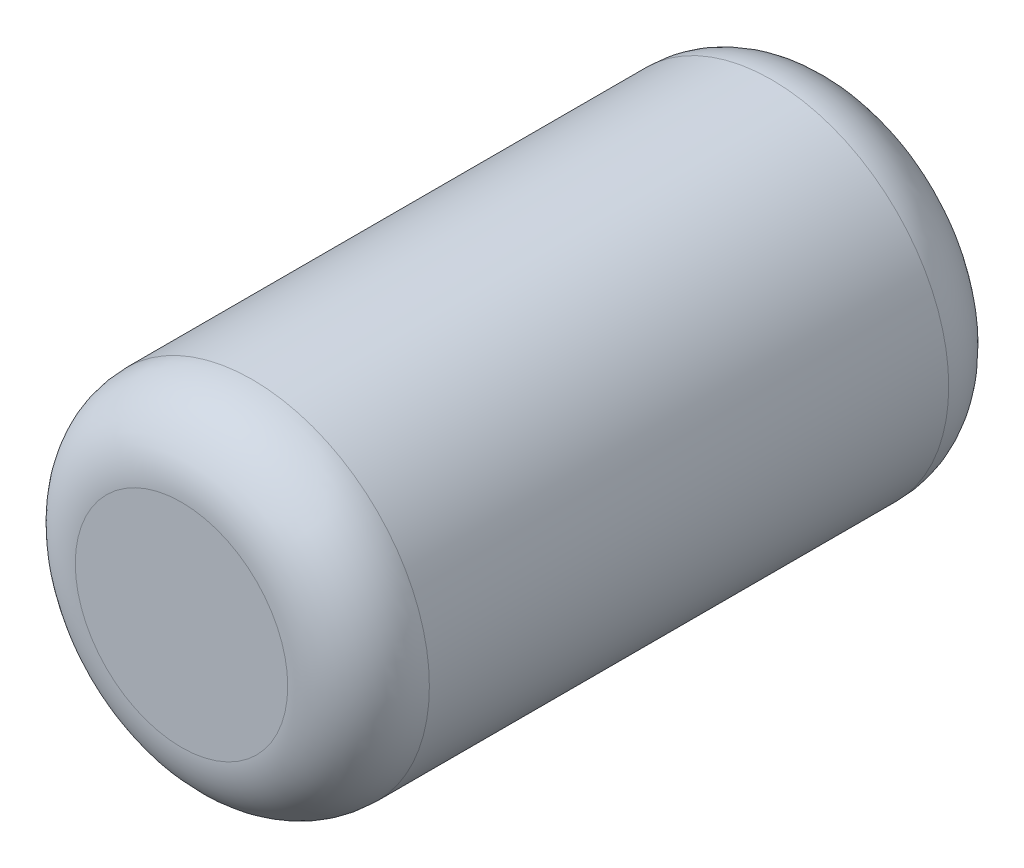
ISO-10303-21;
HEADER;
FILE_DESCRIPTION(('STEP AP214'),'2;1');
FILE_NAME('part.step','',(''),(''),'','','');
FILE_SCHEMA(('AUTOMOTIVE_DESIGN { 1 0 10303 214 1 1 1 1 }'));
ENDSEC;
DATA;
#1=APPLICATION_CONTEXT('core data for automotive mechanical design processes');
#2=APPLICATION_PROTOCOL_DEFINITION('international standard','automotive_design',2000,#1);
#3=PRODUCT_CONTEXT('',#1,'mechanical');
#4=PRODUCT('Part','Part','',(#3));
#5=PRODUCT_RELATED_PRODUCT_CATEGORY('part','',(#4));
#6=PRODUCT_DEFINITION_FORMATION('','',#4);
#7=PRODUCT_DEFINITION_CONTEXT('part definition',#1,'design');
#8=PRODUCT_DEFINITION('design','',#6,#7);
#9=PRODUCT_DEFINITION_SHAPE('','',#8);
#10=(LENGTH_UNIT() NAMED_UNIT(*) SI_UNIT(.MILLI.,.METRE.));
#11=(NAMED_UNIT(*) PLANE_ANGLE_UNIT() SI_UNIT($,.RADIAN.));
#12=(NAMED_UNIT(*) SI_UNIT($,.STERADIAN.) SOLID_ANGLE_UNIT());
#13=UNCERTAINTY_MEASURE_WITH_UNIT(LENGTH_MEASURE(1.E-05),#10,'distance_accuracy_value','');
#14=(GEOMETRIC_REPRESENTATION_CONTEXT(3) GLOBAL_UNCERTAINTY_ASSIGNED_CONTEXT((#13)) GLOBAL_UNIT_ASSIGNED_CONTEXT((#10,
#11,#12)) REPRESENTATION_CONTEXT('',''));
#15=CARTESIAN_POINT('',(0.,0.,0.));
#16=DIRECTION('',(0.,0.,1.));
#17=DIRECTION('',(1.,0.,0.));
#18=AXIS2_PLACEMENT_3D('',#15,#16,#17);
#19=CARTESIAN_POINT('',(0.,0.,28.));
#20=DIRECTION('',(0.,0.,-1.));
#21=DIRECTION('',(-1.,0.,0.));
#22=AXIS2_PLACEMENT_3D('',#19,#20,#21);
#23=CYLINDRICAL_SURFACE('',#22,7.5);
#24=CARTESIAN_POINT('',(0.,0.,25.));
#25=DIRECTION('',(0.,0.,1.));
#26=DIRECTION('',(1.,0.,0.));
#27=AXIS2_PLACEMENT_3D('',#24,#25,#26);
#28=CIRCLE('',#27,7.5);
#29=CARTESIAN_POINT('',(7.5,0.,25.));
#30=VERTEX_POINT('',#29);
#31=EDGE_CURVE('E42',#30,#30,#28,.F.);
#32=ORIENTED_EDGE('',*,*,#31,.T.);
#33=EDGE_LOOP('',(#32));
#34=FACE_BOUND('',#33,.T.);
#35=CARTESIAN_POINT('',(0.,0.,3.));
#36=DIRECTION('',(0.,0.,1.));
#37=DIRECTION('',(1.,0.,0.));
#38=AXIS2_PLACEMENT_3D('',#35,#36,#37);
#39=CIRCLE('',#38,7.5);
#40=CARTESIAN_POINT('',(7.5,0.,3.));
#41=VERTEX_POINT('',#40);
#42=EDGE_CURVE('E46',#41,#41,#39,.T.);
#43=ORIENTED_EDGE('',*,*,#42,.T.);
#44=EDGE_LOOP('',(#43));
#45=FACE_BOUND('',#44,.T.);
#46=ADVANCED_FACE('F35',(#34,#45),#23,.T.);
#47=CARTESIAN_POINT('',(0.,0.,28.));
#48=DIRECTION('',(0.,0.,1.));
#49=DIRECTION('',(1.,0.,0.));
#50=AXIS2_PLACEMENT_3D('',#47,#48,#49);
#51=PLANE('',#50);
#52=CARTESIAN_POINT('',(0.,0.,28.));
#53=DIRECTION('',(0.,0.,1.));
#54=DIRECTION('',(1.,0.,0.));
#55=AXIS2_PLACEMENT_3D('',#52,#53,#54);
#56=CIRCLE('',#55,4.5);
#57=CARTESIAN_POINT('',(4.5,0.,28.));
#58=VERTEX_POINT('',#57);
#59=EDGE_CURVE('E50',#58,#58,#56,.T.);
#60=ORIENTED_EDGE('',*,*,#59,.T.);
#61=EDGE_LOOP('',(#60));
#62=FACE_BOUND('',#61,.T.);
#63=ADVANCED_FACE('F56',(#62),#51,.T.);
#64=CARTESIAN_POINT('',(0.,0.,0.));
#65=DIRECTION('',(0.,0.,1.));
#66=DIRECTION('',(1.,0.,0.));
#67=AXIS2_PLACEMENT_3D('',#64,#65,#66);
#68=PLANE('',#67);
#69=CARTESIAN_POINT('',(0.,0.,0.));
#70=DIRECTION('',(0.,0.,1.));
#71=DIRECTION('',(1.,0.,0.));
#72=AXIS2_PLACEMENT_3D('',#69,#70,#71);
#73=CIRCLE('',#72,4.5);
#74=CARTESIAN_POINT('',(4.5,0.,0.));
#75=VERTEX_POINT('',#74);
#76=EDGE_CURVE('E10',#75,#75,#73,.F.);
#77=ORIENTED_EDGE('',*,*,#76,.T.);
#78=EDGE_LOOP('',(#77));
#79=FACE_BOUND('',#78,.T.);
#80=ADVANCED_FACE('F60',(#79),#68,.F.);
#81=CARTESIAN_POINT('',(0.,0.,25.));
#82=DIRECTION('',(0.,0.,1.));
#83=DIRECTION('',(1.,0.,0.));
#84=AXIS2_PLACEMENT_3D('',#81,#82,#83);
#85=TOROIDAL_SURFACE('',#84,4.5,3.);
#86=ORIENTED_EDGE('',*,*,#31,.F.);
#87=EDGE_LOOP('',(#86));
#88=FACE_BOUND('',#87,.T.);
#89=ORIENTED_EDGE('',*,*,#59,.F.);
#90=EDGE_LOOP('',(#89));
#91=FACE_BOUND('',#90,.T.);
#92=ADVANCED_FACE('F58',(#88,#91),#85,.T.);
#93=CARTESIAN_POINT('',(0.,0.,3.));
#94=DIRECTION('',(0.,0.,1.));
#95=DIRECTION('',(1.,0.,0.));
#96=AXIS2_PLACEMENT_3D('',#93,#94,#95);
#97=TOROIDAL_SURFACE('',#96,4.5,3.);
#98=ORIENTED_EDGE('',*,*,#76,.F.);
#99=EDGE_LOOP('',(#98));
#100=FACE_BOUND('',#99,.T.);
#101=ORIENTED_EDGE('',*,*,#42,.F.);
#102=EDGE_LOOP('',(#101));
#103=FACE_BOUND('',#102,.T.);
#104=ADVANCED_FACE('F37',(#100,#103),#97,.T.);
#105=CLOSED_SHELL('',(#46,#63,#80,#92,#104));
#106=MANIFOLD_SOLID_BREP('B2',#105);
#107=ADVANCED_BREP_SHAPE_REPRESENTATION('',(#18,#106),#14);
#108=SHAPE_DEFINITION_REPRESENTATION(#9,#107);
ENDSEC;
END-ISO-10303-21;
